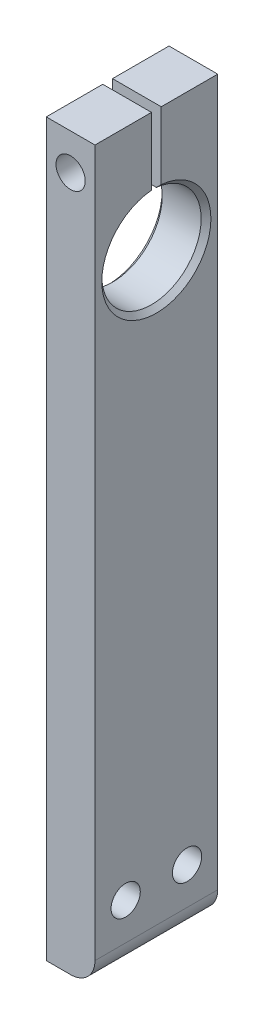
ISO-10303-21;
HEADER;
FILE_DESCRIPTION(('STEP AP214'),'2;1');
FILE_NAME('part.step','',(''),(''),'','','');
FILE_SCHEMA(('AUTOMOTIVE_DESIGN { 1 0 10303 214 1 1 1 1 }'));
ENDSEC;
DATA;
#1=APPLICATION_CONTEXT('core data for automotive mechanical design processes');
#2=APPLICATION_PROTOCOL_DEFINITION('international standard','automotive_design',2000,#1);
#3=PRODUCT_CONTEXT('',#1,'mechanical');
#4=PRODUCT('Part','Part','',(#3));
#5=PRODUCT_RELATED_PRODUCT_CATEGORY('part','',(#4));
#6=PRODUCT_DEFINITION_FORMATION('','',#4);
#7=PRODUCT_DEFINITION_CONTEXT('part definition',#1,'design');
#8=PRODUCT_DEFINITION('design','',#6,#7);
#9=PRODUCT_DEFINITION_SHAPE('','',#8);
#10=(LENGTH_UNIT() NAMED_UNIT(*) SI_UNIT(.MILLI.,.METRE.));
#11=(NAMED_UNIT(*) PLANE_ANGLE_UNIT() SI_UNIT($,.RADIAN.));
#12=(NAMED_UNIT(*) SI_UNIT($,.STERADIAN.) SOLID_ANGLE_UNIT());
#13=UNCERTAINTY_MEASURE_WITH_UNIT(LENGTH_MEASURE(1.E-05),#10,'distance_accuracy_value','');
#14=(GEOMETRIC_REPRESENTATION_CONTEXT(3) GLOBAL_UNCERTAINTY_ASSIGNED_CONTEXT((#13)) GLOBAL_UNIT_ASSIGNED_CONTEXT((#10,
#11,#12)) REPRESENTATION_CONTEXT('',''));
#15=CARTESIAN_POINT('',(0.,0.,0.));
#16=DIRECTION('',(0.,0.,1.));
#17=DIRECTION('',(1.,0.,0.));
#18=AXIS2_PLACEMENT_3D('',#15,#16,#17);
#19=CARTESIAN_POINT('',(10.,-112.4,6.3));
#20=DIRECTION('',(-1.,0.,0.));
#21=DIRECTION('',(0.,0.,1.));
#22=AXIS2_PLACEMENT_3D('',#19,#20,#21);
#23=CYLINDRICAL_SURFACE('',#22,1.70000000000001);
#24=CARTESIAN_POINT('',(0.,-112.4,6.3));
#25=DIRECTION('',(1.,0.,0.));
#26=DIRECTION('',(0.,0.,-1.));
#27=AXIS2_PLACEMENT_3D('',#24,#25,#26);
#28=CIRCLE('',#27,1.70000000000001);
#29=CARTESIAN_POINT('',(0.,-112.4,4.59999999999999));
#30=VERTEX_POINT('',#29);
#31=EDGE_CURVE('E233',#30,#30,#28,.T.);
#32=ORIENTED_EDGE('',*,*,#31,.F.);
#33=EDGE_LOOP('',(#32));
#34=FACE_BOUND('',#33,.T.);
#35=CARTESIAN_POINT('',(5.,-112.4,6.3));
#36=DIRECTION('',(1.,0.,0.));
#37=DIRECTION('',(0.,0.,-1.));
#38=AXIS2_PLACEMENT_3D('',#35,#36,#37);
#39=CIRCLE('',#38,1.70000000000001);
#40=CARTESIAN_POINT('',(5.,-112.4,4.59999999999999));
#41=VERTEX_POINT('',#40);
#42=EDGE_CURVE('E39',#41,#41,#39,.T.);
#43=ORIENTED_EDGE('',*,*,#42,.T.);
#44=EDGE_LOOP('',(#43));
#45=FACE_BOUND('',#44,.T.);
#46=ADVANCED_FACE('F34',(#34,#45),#23,.F.);
#47=CARTESIAN_POINT('',(10.,-112.4,-6.3));
#48=DIRECTION('',(-1.,0.,0.));
#49=DIRECTION('',(0.,0.,1.));
#50=AXIS2_PLACEMENT_3D('',#47,#48,#49);
#51=CYLINDRICAL_SURFACE('',#50,1.7);
#52=CARTESIAN_POINT('',(0.,-112.4,-6.3));
#53=DIRECTION('',(1.,0.,0.));
#54=DIRECTION('',(0.,0.,-1.));
#55=AXIS2_PLACEMENT_3D('',#52,#53,#54);
#56=CIRCLE('',#55,1.7);
#57=CARTESIAN_POINT('',(0.,-112.4,-8.));
#58=VERTEX_POINT('',#57);
#59=EDGE_CURVE('E228',#58,#58,#56,.T.);
#60=ORIENTED_EDGE('',*,*,#59,.F.);
#61=EDGE_LOOP('',(#60));
#62=FACE_BOUND('',#61,.T.);
#63=CARTESIAN_POINT('',(5.,-112.4,-6.3));
#64=DIRECTION('',(1.,0.,0.));
#65=DIRECTION('',(0.,0.,-1.));
#66=AXIS2_PLACEMENT_3D('',#63,#64,#65);
#67=CIRCLE('',#66,1.7);
#68=CARTESIAN_POINT('',(5.,-112.4,-8.));
#69=VERTEX_POINT('',#68);
#70=EDGE_CURVE('E394',#69,#69,#67,.T.);
#71=ORIENTED_EDGE('',*,*,#70,.T.);
#72=EDGE_LOOP('',(#71));
#73=FACE_BOUND('',#72,.T.);
#74=ADVANCED_FACE('F318',(#62,#73),#51,.F.);
#75=CARTESIAN_POINT('',(5.,17.575,-12.6));
#76=DIRECTION('',(0.,0.,1.));
#77=DIRECTION('',(1.,0.,0.));
#78=AXIS2_PLACEMENT_3D('',#75,#76,#77);
#79=CYLINDRICAL_SURFACE('',#78,1.7);
#80=CARTESIAN_POINT('',(5.,17.575,1.));
#81=DIRECTION('',(0.,0.,1.));
#82=DIRECTION('',(0.,-1.,0.));
#83=AXIS2_PLACEMENT_3D('',#80,#81,#82);
#84=CIRCLE('',#83,1.7);
#85=CARTESIAN_POINT('',(5.,15.875,1.));
#86=VERTEX_POINT('',#85);
#87=EDGE_CURVE('E211',#86,#86,#84,.T.);
#88=ORIENTED_EDGE('',*,*,#87,.F.);
#89=EDGE_LOOP('',(#88));
#90=FACE_BOUND('',#89,.T.);
#91=CARTESIAN_POINT('',(5.,17.575,4.6));
#92=DIRECTION('',(0.,0.,1.));
#93=DIRECTION('',(1.,0.,0.));
#94=AXIS2_PLACEMENT_3D('',#91,#92,#93);
#95=CIRCLE('',#94,1.7);
#96=CARTESIAN_POINT('',(6.7,17.575,4.6));
#97=VERTEX_POINT('',#96);
#98=EDGE_CURVE('E192',#97,#97,#95,.F.);
#99=ORIENTED_EDGE('',*,*,#98,.F.);
#100=EDGE_LOOP('',(#99));
#101=FACE_BOUND('',#100,.T.);
#102=ADVANCED_FACE('F362',(#90,#101),#79,.F.);
#103=CARTESIAN_POINT('',(0.,0.,0.));
#104=DIRECTION('',(-1.,0.,0.));
#105=DIRECTION('',(0.,0.,1.));
#106=AXIS2_PLACEMENT_3D('',#103,#104,#105);
#107=PLANE('',#106);
#108=ORIENTED_EDGE('',*,*,#59,.T.);
#109=EDGE_LOOP('',(#108));
#110=FACE_BOUND('',#109,.T.);
#111=ORIENTED_EDGE('',*,*,#31,.T.);
#112=EDGE_LOOP('',(#111));
#113=FACE_BOUND('',#112,.T.);
#114=DIRECTION('',(0.,1.,0.));
#115=VECTOR('',#114,1.);
#116=CARTESIAN_POINT('',(0.,25.,0.999999999999999));
#117=LINE('',#116,#115);
#118=CARTESIAN_POINT('',(0.,11.1552678139075,1.));
#119=VERTEX_POINT('',#118);
#120=CARTESIAN_POINT('',(0.,25.,0.999999999999999));
#121=VERTEX_POINT('',#120);
#122=EDGE_CURVE('E216',#119,#121,#117,.T.);
#123=ORIENTED_EDGE('',*,*,#122,.F.);
#124=CARTESIAN_POINT('',(0.,0.,0.));
#125=DIRECTION('',(-1.,0.,0.));
#126=DIRECTION('',(0.,0.,1.));
#127=AXIS2_PLACEMENT_3D('',#124,#125,#126);
#128=CIRCLE('',#127,11.2);
#129=CARTESIAN_POINT('',(0.,11.1552678139075,-1.));
#130=VERTEX_POINT('',#129);
#131=EDGE_CURVE('E11',#119,#130,#128,.F.);
#132=ORIENTED_EDGE('',*,*,#131,.T.);
#133=DIRECTION('',(0.,-1.,0.));
#134=VECTOR('',#133,1.);
#135=CARTESIAN_POINT('',(0.,25.,-1.));
#136=LINE('',#135,#134);
#137=CARTESIAN_POINT('',(0.,25.,-1.));
#138=VERTEX_POINT('',#137);
#139=EDGE_CURVE('E220',#138,#130,#136,.T.);
#140=ORIENTED_EDGE('',*,*,#139,.F.);
#141=DIRECTION('',(0.,0.,1.));
#142=VECTOR('',#141,1.);
#143=CARTESIAN_POINT('',(0.,25.,12.6));
#144=LINE('',#143,#142);
#145=CARTESIAN_POINT('',(0.,25.,-12.6));
#146=VERTEX_POINT('',#145);
#147=EDGE_CURVE('E250',#146,#138,#144,.T.);
#148=ORIENTED_EDGE('',*,*,#147,.F.);
#149=DIRECTION('',(0.,1.,0.));
#150=VECTOR('',#149,1.);
#151=CARTESIAN_POINT('',(0.,25.,-12.6));
#152=LINE('',#151,#150);
#153=CARTESIAN_POINT('',(0.,-125.,-12.6));
#154=VERTEX_POINT('',#153);
#155=EDGE_CURVE('E236',#154,#146,#152,.T.);
#156=ORIENTED_EDGE('',*,*,#155,.F.);
#157=DIRECTION('',(0.,0.,-1.));
#158=VECTOR('',#157,1.);
#159=CARTESIAN_POINT('',(0.,-125.,12.6));
#160=LINE('',#159,#158);
#161=CARTESIAN_POINT('',(0.,-125.,12.6));
#162=VERTEX_POINT('',#161);
#163=EDGE_CURVE('E240',#162,#154,#160,.T.);
#164=ORIENTED_EDGE('',*,*,#163,.F.);
#165=DIRECTION('',(0.,-1.,0.));
#166=VECTOR('',#165,1.);
#167=CARTESIAN_POINT('',(0.,-25.,12.6));
#168=LINE('',#167,#166);
#169=CARTESIAN_POINT('',(0.,25.,12.6));
#170=VERTEX_POINT('',#169);
#171=EDGE_CURVE('E253',#170,#162,#168,.T.);
#172=ORIENTED_EDGE('',*,*,#171,.F.);
#173=EDGE_CURVE('E249',#121,#170,#144,.T.);
#174=ORIENTED_EDGE('',*,*,#173,.F.);
#175=EDGE_LOOP('',(#123,#132,#140,#148,#156,#164,#172,#174));
#176=FACE_BOUND('',#175,.T.);
#177=DIRECTION('',(0.,0.,1.));
#178=VECTOR('',#177,1.);
#179=CARTESIAN_POINT('',(0.,14.575,-6.5));
#180=LINE('',#179,#178);
#181=CARTESIAN_POINT('',(0.,14.575,-6.5));
#182=VERTEX_POINT('',#181);
#183=CARTESIAN_POINT('',(0.,14.575,-4.));
#184=VERTEX_POINT('',#183);
#185=EDGE_CURVE('E202',#182,#184,#180,.T.);
#186=ORIENTED_EDGE('',*,*,#185,.F.);
#187=DIRECTION('',(0.,-1.,0.));
#188=VECTOR('',#187,1.);
#189=CARTESIAN_POINT('',(0.,20.575,-6.5));
#190=LINE('',#189,#188);
#191=CARTESIAN_POINT('',(0.,20.575,-6.5));
#192=VERTEX_POINT('',#191);
#193=EDGE_CURVE('E187',#192,#182,#190,.T.);
#194=ORIENTED_EDGE('',*,*,#193,.F.);
#195=DIRECTION('',(0.,0.,1.));
#196=VECTOR('',#195,1.);
#197=CARTESIAN_POINT('',(0.,20.575,-6.5));
#198=LINE('',#197,#196);
#199=CARTESIAN_POINT('',(0.,20.575,-4.));
#200=VERTEX_POINT('',#199);
#201=EDGE_CURVE('E204',#192,#200,#198,.T.);
#202=ORIENTED_EDGE('',*,*,#201,.T.);
#203=DIRECTION('',(0.,-1.,0.));
#204=VECTOR('',#203,1.);
#205=CARTESIAN_POINT('',(0.,20.575,-4.));
#206=LINE('',#205,#204);
#207=EDGE_CURVE('E180',#200,#184,#206,.T.);
#208=ORIENTED_EDGE('',*,*,#207,.T.);
#209=EDGE_LOOP('',(#186,#194,#202,#208));
#210=FACE_BOUND('',#209,.T.);
#211=ADVANCED_FACE('F358',(#110,#113,#176,#210),#107,.T.);
#212=CARTESIAN_POINT('',(5.,17.575,-12.6));
#213=DIRECTION('',(0.,0.,1.));
#214=DIRECTION('',(1.,0.,0.));
#215=AXIS2_PLACEMENT_3D('',#212,#213,#214);
#216=CIRCLE('',#215,1.7);
#217=CARTESIAN_POINT('',(6.7,17.575,-12.6));
#218=VERTEX_POINT('',#217);
#219=EDGE_CURVE('E208',#218,#218,#216,.T.);
#220=ORIENTED_EDGE('',*,*,#219,.F.);
#221=EDGE_LOOP('',(#220));
#222=FACE_BOUND('',#221,.T.);
#223=CARTESIAN_POINT('',(5.,17.575,-6.5));
#224=DIRECTION('',(0.,0.,1.));
#225=DIRECTION('',(1.,0.,0.));
#226=AXIS2_PLACEMENT_3D('',#223,#224,#225);
#227=CIRCLE('',#226,1.7);
#228=CARTESIAN_POINT('',(6.7,17.575,-6.5));
#229=VERTEX_POINT('',#228);
#230=EDGE_CURVE('E212',#229,#229,#227,.F.);
#231=ORIENTED_EDGE('',*,*,#230,.F.);
#232=EDGE_LOOP('',(#231));
#233=FACE_BOUND('',#232,.T.);
#234=ADVANCED_FACE('F361',(#222,#233),#79,.F.);
#235=CARTESIAN_POINT('',(10.,25.,12.6));
#236=DIRECTION('',(0.,-1.,0.));
#237=DIRECTION('',(0.,0.,-1.));
#238=AXIS2_PLACEMENT_3D('',#235,#236,#237);
#239=PLANE('',#238);
#240=DIRECTION('',(0.,0.,1.));
#241=VECTOR('',#240,1.);
#242=CARTESIAN_POINT('',(10.,25.,12.6));
#243=LINE('',#242,#241);
#244=CARTESIAN_POINT('',(10.,25.,0.999999999999999));
#245=VERTEX_POINT('',#244);
#246=CARTESIAN_POINT('',(10.,25.,12.6));
#247=VERTEX_POINT('',#246);
#248=EDGE_CURVE('E239',#245,#247,#243,.T.);
#249=ORIENTED_EDGE('',*,*,#248,.F.);
#250=DIRECTION('',(-1.,0.,0.));
#251=VECTOR('',#250,1.);
#252=CARTESIAN_POINT('',(10.,25.,0.999999999999999));
#253=LINE('',#252,#251);
#254=EDGE_CURVE('E222',#245,#121,#253,.T.);
#255=ORIENTED_EDGE('',*,*,#254,.T.);
#256=ORIENTED_EDGE('',*,*,#173,.T.);
#257=DIRECTION('',(-1.,0.,0.));
#258=VECTOR('',#257,1.);
#259=CARTESIAN_POINT('',(10.,25.,12.6));
#260=LINE('',#259,#258);
#261=EDGE_CURVE('E261',#247,#170,#260,.T.);
#262=ORIENTED_EDGE('',*,*,#261,.F.);
#263=EDGE_LOOP('',(#249,#255,#256,#262));
#264=FACE_BOUND('',#263,.T.);
#265=ADVANCED_FACE('F350',(#264),#239,.F.);
#266=CARTESIAN_POINT('',(10.,0.,0.));
#267=DIRECTION('',(-1.,0.,0.));
#268=DIRECTION('',(0.,0.,1.));
#269=AXIS2_PLACEMENT_3D('',#266,#267,#268);
#270=PLANE('',#269);
#271=CARTESIAN_POINT('',(10.,-112.4,6.3));
#272=DIRECTION('',(1.,0.,0.));
#273=DIRECTION('',(0.,0.,-1.));
#274=AXIS2_PLACEMENT_3D('',#271,#272,#273);
#275=CIRCLE('',#274,3.);
#276=CARTESIAN_POINT('',(10.,-112.4,3.3));
#277=VERTEX_POINT('',#276);
#278=EDGE_CURVE('E386',#277,#277,#275,.T.);
#279=ORIENTED_EDGE('',*,*,#278,.F.);
#280=EDGE_LOOP('',(#279));
#281=FACE_BOUND('',#280,.T.);
#282=CARTESIAN_POINT('',(10.,-112.4,-6.3));
#283=DIRECTION('',(1.,0.,0.));
#284=DIRECTION('',(0.,0.,-1.));
#285=AXIS2_PLACEMENT_3D('',#282,#283,#284);
#286=CIRCLE('',#285,3.);
#287=CARTESIAN_POINT('',(10.,-112.4,-9.3));
#288=VERTEX_POINT('',#287);
#289=EDGE_CURVE('E380',#288,#288,#286,.T.);
#290=ORIENTED_EDGE('',*,*,#289,.F.);
#291=EDGE_LOOP('',(#290));
#292=FACE_BOUND('',#291,.T.);
#293=DIRECTION('',(0.,-1.,0.));
#294=VECTOR('',#293,1.);
#295=CARTESIAN_POINT('',(10.,25.,-1.));
#296=LINE('',#295,#294);
#297=CARTESIAN_POINT('',(10.,25.,-1.));
#298=VERTEX_POINT('',#297);
#299=CARTESIAN_POINT('',(10.,11.1552678139075,-1.));
#300=VERTEX_POINT('',#299);
#301=EDGE_CURVE('E219',#298,#300,#296,.T.);
#302=ORIENTED_EDGE('',*,*,#301,.T.);
#303=CARTESIAN_POINT('',(10.,0.,0.));
#304=DIRECTION('',(-1.,0.,0.));
#305=DIRECTION('',(0.,0.,1.));
#306=AXIS2_PLACEMENT_3D('',#303,#304,#305);
#307=CIRCLE('',#306,11.2);
#308=CARTESIAN_POINT('',(10.,11.1552678139075,1.));
#309=VERTEX_POINT('',#308);
#310=EDGE_CURVE('E60',#300,#309,#307,.T.);
#311=ORIENTED_EDGE('',*,*,#310,.T.);
#312=DIRECTION('',(0.,1.,0.));
#313=VECTOR('',#312,1.);
#314=CARTESIAN_POINT('',(10.,25.,0.999999999999999));
#315=LINE('',#314,#313);
#316=EDGE_CURVE('E217',#309,#245,#315,.T.);
#317=ORIENTED_EDGE('',*,*,#316,.T.);
#318=ORIENTED_EDGE('',*,*,#248,.T.);
#319=DIRECTION('',(0.,-1.,0.));
#320=VECTOR('',#319,1.);
#321=CARTESIAN_POINT('',(10.,25.,12.6));
#322=LINE('',#321,#320);
#323=CARTESIAN_POINT('',(10.,-120.,12.6));
#324=VERTEX_POINT('',#323);
#325=EDGE_CURVE('E244',#247,#324,#322,.T.);
#326=ORIENTED_EDGE('',*,*,#325,.T.);
#327=DIRECTION('',(0.,0.,-1.));
#328=VECTOR('',#327,1.);
#329=CARTESIAN_POINT('',(10.,-120.,0.));
#330=LINE('',#329,#328);
#331=CARTESIAN_POINT('',(10.,-120.,-12.6));
#332=VERTEX_POINT('',#331);
#333=EDGE_CURVE('E272',#324,#332,#330,.T.);
#334=ORIENTED_EDGE('',*,*,#333,.T.);
#335=DIRECTION('',(0.,1.,0.));
#336=VECTOR('',#335,1.);
#337=CARTESIAN_POINT('',(10.,-125.,-12.6));
#338=LINE('',#337,#336);
#339=CARTESIAN_POINT('',(10.,25.,-12.6));
#340=VERTEX_POINT('',#339);
#341=EDGE_CURVE('E237',#332,#340,#338,.T.);
#342=ORIENTED_EDGE('',*,*,#341,.T.);
#343=EDGE_CURVE('E241',#340,#298,#243,.T.);
#344=ORIENTED_EDGE('',*,*,#343,.T.);
#345=EDGE_LOOP('',(#302,#311,#317,#318,#326,#334,#342,#344));
#346=FACE_BOUND('',#345,.T.);
#347=ADVANCED_FACE('F344',(#281,#292,#346),#270,.F.);
#348=CARTESIAN_POINT('',(10.,25.,-12.6));
#349=DIRECTION('',(0.,0.,1.));
#350=DIRECTION('',(0.,-1.,0.));
#351=AXIS2_PLACEMENT_3D('',#348,#349,#350);
#352=PLANE('',#351);
#353=ORIENTED_EDGE('',*,*,#219,.T.);
#354=EDGE_LOOP('',(#353));
#355=FACE_BOUND('',#354,.T.);
#356=ORIENTED_EDGE('',*,*,#341,.F.);
#357=CARTESIAN_POINT('',(5.,-120.,-12.6));
#358=DIRECTION('',(0.,0.,1.));
#359=DIRECTION('',(0.,-1.,0.));
#360=AXIS2_PLACEMENT_3D('',#357,#358,#359);
#361=CIRCLE('',#360,5.);
#362=CARTESIAN_POINT('',(5.,-125.,-12.6));
#363=VERTEX_POINT('',#362);
#364=EDGE_CURVE('E281',#332,#363,#361,.F.);
#365=ORIENTED_EDGE('',*,*,#364,.T.);
#366=DIRECTION('',(-1.,0.,0.));
#367=VECTOR('',#366,1.);
#368=CARTESIAN_POINT('',(10.,-125.,-12.6));
#369=LINE('',#368,#367);
#370=EDGE_CURVE('E247',#363,#154,#369,.T.);
#371=ORIENTED_EDGE('',*,*,#370,.T.);
#372=ORIENTED_EDGE('',*,*,#155,.T.);
#373=DIRECTION('',(-1.,0.,0.));
#374=VECTOR('',#373,1.);
#375=CARTESIAN_POINT('',(10.,25.,-12.6));
#376=LINE('',#375,#374);
#377=EDGE_CURVE('E264',#340,#146,#376,.T.);
#378=ORIENTED_EDGE('',*,*,#377,.F.);
#379=EDGE_LOOP('',(#356,#365,#371,#372,#378));
#380=FACE_BOUND('',#379,.T.);
#381=ADVANCED_FACE('F340',(#355,#380),#352,.F.);
#382=ORIENTED_EDGE('',*,*,#147,.T.);
#383=DIRECTION('',(-1.,0.,0.));
#384=VECTOR('',#383,1.);
#385=CARTESIAN_POINT('',(10.,25.,-1.));
#386=LINE('',#385,#384);
#387=EDGE_CURVE('E226',#298,#138,#386,.T.);
#388=ORIENTED_EDGE('',*,*,#387,.F.);
#389=ORIENTED_EDGE('',*,*,#343,.F.);
#390=ORIENTED_EDGE('',*,*,#377,.T.);
#391=EDGE_LOOP('',(#382,#388,#389,#390));
#392=FACE_BOUND('',#391,.T.);
#393=ADVANCED_FACE('F343',(#392),#239,.F.);
#394=CARTESIAN_POINT('',(10.,-25.,12.6));
#395=DIRECTION('',(0.,0.,-1.));
#396=DIRECTION('',(-1.,0.,0.));
#397=AXIS2_PLACEMENT_3D('',#394,#395,#396);
#398=PLANE('',#397);
#399=CARTESIAN_POINT('',(5.,17.575,12.6));
#400=DIRECTION('',(0.,0.,1.));
#401=DIRECTION('',(1.,0.,0.));
#402=AXIS2_PLACEMENT_3D('',#399,#400,#401);
#403=CIRCLE('',#402,3.);
#404=CARTESIAN_POINT('',(8.,17.575,12.6));
#405=VERTEX_POINT('',#404);
#406=EDGE_CURVE('E183',#405,#405,#403,.T.);
#407=ORIENTED_EDGE('',*,*,#406,.F.);
#408=EDGE_LOOP('',(#407));
#409=FACE_BOUND('',#408,.T.);
#410=DIRECTION('',(-1.,0.,0.));
#411=VECTOR('',#410,1.);
#412=CARTESIAN_POINT('',(10.,-125.,12.6));
#413=LINE('',#412,#411);
#414=CARTESIAN_POINT('',(5.,-125.,12.6));
#415=VERTEX_POINT('',#414);
#416=EDGE_CURVE('E259',#415,#162,#413,.T.);
#417=ORIENTED_EDGE('',*,*,#416,.F.);
#418=CARTESIAN_POINT('',(5.,-120.,12.6));
#419=DIRECTION('',(0.,0.,-1.));
#420=DIRECTION('',(-1.,0.,0.));
#421=AXIS2_PLACEMENT_3D('',#418,#419,#420);
#422=CIRCLE('',#421,5.);
#423=EDGE_CURVE('E285',#415,#324,#422,.F.);
#424=ORIENTED_EDGE('',*,*,#423,.T.);
#425=ORIENTED_EDGE('',*,*,#325,.F.);
#426=ORIENTED_EDGE('',*,*,#261,.T.);
#427=ORIENTED_EDGE('',*,*,#171,.T.);
#428=EDGE_LOOP('',(#417,#424,#425,#426,#427));
#429=FACE_BOUND('',#428,.T.);
#430=ADVANCED_FACE('F348',(#409,#429),#398,.F.);
#431=CARTESIAN_POINT('',(10.,-125.,12.6));
#432=DIRECTION('',(0.,1.,0.));
#433=DIRECTION('',(0.,0.,1.));
#434=AXIS2_PLACEMENT_3D('',#431,#432,#433);
#435=PLANE('',#434);
#436=ORIENTED_EDGE('',*,*,#370,.F.);
#437=DIRECTION('',(0.,0.,-1.));
#438=VECTOR('',#437,1.);
#439=CARTESIAN_POINT('',(5.,-125.,12.6));
#440=LINE('',#439,#438);
#441=EDGE_CURVE('E283',#363,#415,#440,.F.);
#442=ORIENTED_EDGE('',*,*,#441,.T.);
#443=ORIENTED_EDGE('',*,*,#416,.T.);
#444=ORIENTED_EDGE('',*,*,#163,.T.);
#445=EDGE_LOOP('',(#436,#442,#443,#444));
#446=FACE_BOUND('',#445,.T.);
#447=ADVANCED_FACE('F353',(#446),#435,.F.);
#448=CARTESIAN_POINT('',(10.,0.,0.));
#449=DIRECTION('',(-1.,0.,0.));
#450=DIRECTION('',(0.,0.,1.));
#451=AXIS2_PLACEMENT_3D('',#448,#449,#450);
#452=CYLINDRICAL_SURFACE('',#451,10.2);
#453=DIRECTION('',(-1.,0.,0.));
#454=VECTOR('',#453,1.);
#455=CARTESIAN_POINT('',(10.,10.1508620323596,1.));
#456=LINE('',#455,#454);
#457=CARTESIAN_POINT('',(9.00000000000001,10.1508620323596,1.));
#458=VERTEX_POINT('',#457);
#459=CARTESIAN_POINT('',(0.99999999999998,10.1508620323596,1.));
#460=VERTEX_POINT('',#459);
#461=EDGE_CURVE('E270',#458,#460,#456,.T.);
#462=ORIENTED_EDGE('',*,*,#461,.F.);
#463=CARTESIAN_POINT('',(9.00000000000001,0.,0.));
#464=DIRECTION('',(-1.,0.,0.));
#465=DIRECTION('',(0.,0.,1.));
#466=AXIS2_PLACEMENT_3D('',#463,#464,#465);
#467=CIRCLE('',#466,10.2);
#468=CARTESIAN_POINT('',(9.00000000000001,10.1508620323596,-1.));
#469=VERTEX_POINT('',#468);
#470=EDGE_CURVE('E289',#458,#469,#467,.F.);
#471=ORIENTED_EDGE('',*,*,#470,.T.);
#472=DIRECTION('',(-1.,0.,0.));
#473=VECTOR('',#472,1.);
#474=CARTESIAN_POINT('',(10.,10.1508620323596,-1.));
#475=LINE('',#474,#473);
#476=CARTESIAN_POINT('',(0.99999999999998,10.1508620323596,-1.));
#477=VERTEX_POINT('',#476);
#478=EDGE_CURVE('E267',#477,#469,#475,.F.);
#479=ORIENTED_EDGE('',*,*,#478,.F.);
#480=CARTESIAN_POINT('',(0.99999999999998,0.,0.));
#481=DIRECTION('',(-1.,0.,0.));
#482=DIRECTION('',(0.,0.,1.));
#483=AXIS2_PLACEMENT_3D('',#480,#481,#482);
#484=CIRCLE('',#483,10.2);
#485=EDGE_CURVE('E287',#477,#460,#484,.T.);
#486=ORIENTED_EDGE('',*,*,#485,.T.);
#487=EDGE_LOOP('',(#462,#471,#479,#486));
#488=FACE_BOUND('',#487,.T.);
#489=ADVANCED_FACE('F309',(#488),#452,.F.);
#490=CARTESIAN_POINT('',(10.,25.,-1.));
#491=DIRECTION('',(0.,0.,-1.));
#492=DIRECTION('',(0.,1.,0.));
#493=AXIS2_PLACEMENT_3D('',#490,#491,#492);
#494=PLANE('',#493);
#495=CARTESIAN_POINT('',(5.,17.575,-0.999999999999999));
#496=DIRECTION('',(0.,0.,-1.));
#497=DIRECTION('',(0.,1.,0.));
#498=AXIS2_PLACEMENT_3D('',#495,#496,#497);
#499=CIRCLE('',#498,1.7);
#500=CARTESIAN_POINT('',(5.,19.275,-0.999999999999999));
#501=VERTEX_POINT('',#500);
#502=EDGE_CURVE('E213',#501,#501,#499,.T.);
#503=ORIENTED_EDGE('',*,*,#502,.T.);
#504=EDGE_LOOP('',(#503));
#505=FACE_BOUND('',#504,.T.);
#506=ORIENTED_EDGE('',*,*,#478,.T.);
#507=CARTESIAN_POINT('',(9.00000000000001,10.1508620323596,-1.));
#508=CARTESIAN_POINT('',(9.16663212704616,10.3182973842307,-1.));
#509=CARTESIAN_POINT('',(9.33328152394402,10.4857155420035,-1.));
#510=CARTESIAN_POINT('',(9.66661485727739,10.8205174691861,-1.));
#511=CARTESIAN_POINT('',(9.83329879371286,10.9879012385959,-1.));
#512=CARTESIAN_POINT('',(10.,11.1552678139075,-1.));
#513=B_SPLINE_CURVE_WITH_KNOTS('',3,(#507,#508,#509,#510,#511,#512),.UNSPECIFIED.,.F.,.F.,(4,2,
4),(0.,0.708666176239692,1.41733235177449),.UNSPECIFIED.);
#514=EDGE_CURVE('E298',#469,#300,#513,.T.);
#515=ORIENTED_EDGE('',*,*,#514,.T.);
#516=ORIENTED_EDGE('',*,*,#301,.F.);
#517=ORIENTED_EDGE('',*,*,#387,.T.);
#518=ORIENTED_EDGE('',*,*,#139,.T.);
#519=CARTESIAN_POINT('',(0.,11.1552678139075,-1.));
#520=CARTESIAN_POINT('',(0.16670120628714,10.9879012385959,-1.));
#521=CARTESIAN_POINT('',(0.333385142722605,10.8205174691861,-1.));
#522=CARTESIAN_POINT('',(0.666718476055966,10.4857155420035,-1.));
#523=CARTESIAN_POINT('',(0.833367872953828,10.3182973842307,-1.));
#524=CARTESIAN_POINT('',(0.99999999999998,10.1508620323596,-1.));
#525=B_SPLINE_CURVE_WITH_KNOTS('',3,(#519,#520,#521,#522,#523,#524),.UNSPECIFIED.,.F.,.F.,(4,2,
4),(0.,0.708666175534788,1.41733235177447),.UNSPECIFIED.);
#526=EDGE_CURVE('E292',#130,#477,#525,.T.);
#527=ORIENTED_EDGE('',*,*,#526,.T.);
#528=EDGE_LOOP('',(#506,#515,#516,#517,#518,#527));
#529=FACE_BOUND('',#528,.T.);
#530=ADVANCED_FACE('F303',(#505,#529),#494,.F.);
#531=CARTESIAN_POINT('',(10.,25.,0.999999999999999));
#532=DIRECTION('',(0.,0.,1.));
#533=DIRECTION('',(0.,-1.,0.));
#534=AXIS2_PLACEMENT_3D('',#531,#532,#533);
#535=PLANE('',#534);
#536=ORIENTED_EDGE('',*,*,#87,.T.);
#537=EDGE_LOOP('',(#536));
#538=FACE_BOUND('',#537,.T.);
#539=ORIENTED_EDGE('',*,*,#316,.F.);
#540=CARTESIAN_POINT('',(10.,11.1552678139075,1.));
#541=CARTESIAN_POINT('',(9.83329879371286,10.9879012385959,1.));
#542=CARTESIAN_POINT('',(9.66661485727739,10.8205174691861,1.));
#543=CARTESIAN_POINT('',(9.33328152394402,10.4857155420035,1.));
#544=CARTESIAN_POINT('',(9.16663212704616,10.3182973842307,1.));
#545=CARTESIAN_POINT('',(9.00000000000001,10.1508620323596,1.));
#546=B_SPLINE_CURVE_WITH_KNOTS('',3,(#540,#541,#542,#543,#544,#545),.UNSPECIFIED.,.F.,.F.,(4,2,
4),(0.,0.708666175534799,1.41733235177449),.UNSPECIFIED.);
#547=EDGE_CURVE('E44',#309,#458,#546,.T.);
#548=ORIENTED_EDGE('',*,*,#547,.T.);
#549=ORIENTED_EDGE('',*,*,#461,.T.);
#550=CARTESIAN_POINT('',(0.99999999999998,10.1508620323596,1.));
#551=CARTESIAN_POINT('',(0.833367872953827,10.3182973842307,1.));
#552=CARTESIAN_POINT('',(0.666718476055966,10.4857155420035,1.));
#553=CARTESIAN_POINT('',(0.333385142722605,10.8205174691861,1.));
#554=CARTESIAN_POINT('',(0.16670120628714,10.9879012385959,1.));
#555=CARTESIAN_POINT('',(0.,11.1552678139075,1.));
#556=B_SPLINE_CURVE_WITH_KNOTS('',3,(#550,#551,#552,#553,#554,#555),.UNSPECIFIED.,.F.,.F.,(4,2,
4),(0.,0.708666176239683,1.41733235177447),.UNSPECIFIED.);
#557=EDGE_CURVE('E52',#460,#119,#556,.T.);
#558=ORIENTED_EDGE('',*,*,#557,.T.);
#559=ORIENTED_EDGE('',*,*,#122,.T.);
#560=ORIENTED_EDGE('',*,*,#254,.F.);
#561=EDGE_LOOP('',(#539,#548,#549,#558,#559,#560));
#562=FACE_BOUND('',#561,.T.);
#563=ADVANCED_FACE('F308',(#538,#562),#535,.F.);
#564=CARTESIAN_POINT('',(5.,17.575,-4.));
#565=DIRECTION('',(0.,0.,1.));
#566=DIRECTION('',(1.,0.,0.));
#567=AXIS2_PLACEMENT_3D('',#564,#565,#566);
#568=CIRCLE('',#567,1.7);
#569=CARTESIAN_POINT('',(6.7,17.575,-4.));
#570=VERTEX_POINT('',#569);
#571=EDGE_CURVE('E201',#570,#570,#568,.F.);
#572=ORIENTED_EDGE('',*,*,#571,.T.);
#573=EDGE_LOOP('',(#572));
#574=FACE_BOUND('',#573,.T.);
#575=ORIENTED_EDGE('',*,*,#502,.F.);
#576=EDGE_LOOP('',(#575));
#577=FACE_BOUND('',#576,.T.);
#578=ADVANCED_FACE('F311',(#574,#577),#79,.F.);
#579=CARTESIAN_POINT('',(0.,0.,-6.5));
#580=DIRECTION('',(0.,0.,1.));
#581=DIRECTION('',(1.,0.,0.));
#582=AXIS2_PLACEMENT_3D('',#579,#580,#581);
#583=PLANE('',#582);
#584=DIRECTION('',(0.5,0.866025403784439,0.));
#585=VECTOR('',#584,1.);
#586=CARTESIAN_POINT('',(6.73205080756888,14.575,-6.5));
#587=LINE('',#586,#585);
#588=CARTESIAN_POINT('',(6.73205080756888,14.575,-6.5));
#589=VERTEX_POINT('',#588);
#590=CARTESIAN_POINT('',(8.46410161513776,17.575,-6.5));
#591=VERTEX_POINT('',#590);
#592=EDGE_CURVE('E156',#589,#591,#587,.T.);
#593=ORIENTED_EDGE('',*,*,#592,.T.);
#594=DIRECTION('',(-0.5,0.866025403784439,0.));
#595=VECTOR('',#594,1.);
#596=CARTESIAN_POINT('',(8.46410161513776,17.575,-6.5));
#597=LINE('',#596,#595);
#598=CARTESIAN_POINT('',(6.73205080756888,20.575,-6.5));
#599=VERTEX_POINT('',#598);
#600=EDGE_CURVE('E166',#591,#599,#597,.T.);
#601=ORIENTED_EDGE('',*,*,#600,.T.);
#602=DIRECTION('',(-1.,0.,0.));
#603=VECTOR('',#602,1.);
#604=CARTESIAN_POINT('',(6.73205080756888,20.575,-6.5));
#605=LINE('',#604,#603);
#606=EDGE_CURVE('E171',#599,#192,#605,.T.);
#607=ORIENTED_EDGE('',*,*,#606,.T.);
#608=ORIENTED_EDGE('',*,*,#193,.T.);
#609=DIRECTION('',(1.,0.,0.));
#610=VECTOR('',#609,1.);
#611=CARTESIAN_POINT('',(0.,14.575,-6.5));
#612=LINE('',#611,#610);
#613=EDGE_CURVE('E163',#182,#589,#612,.T.);
#614=ORIENTED_EDGE('',*,*,#613,.T.);
#615=EDGE_LOOP('',(#593,#601,#607,#608,#614));
#616=FACE_BOUND('',#615,.T.);
#617=ORIENTED_EDGE('',*,*,#230,.T.);
#618=EDGE_LOOP('',(#617));
#619=FACE_BOUND('',#618,.T.);
#620=ADVANCED_FACE('F173',(#616,#619),#583,.T.);
#621=CARTESIAN_POINT('',(0.,0.,-4.));
#622=DIRECTION('',(0.,0.,1.));
#623=DIRECTION('',(1.,0.,0.));
#624=AXIS2_PLACEMENT_3D('',#621,#622,#623);
#625=PLANE('',#624);
#626=DIRECTION('',(0.5,0.866025403784439,0.));
#627=VECTOR('',#626,1.);
#628=CARTESIAN_POINT('',(6.73205080756888,14.575,-4.));
#629=LINE('',#628,#627);
#630=CARTESIAN_POINT('',(6.73205080756888,14.575,-4.));
#631=VERTEX_POINT('',#630);
#632=CARTESIAN_POINT('',(8.46410161513776,17.575,-4.));
#633=VERTEX_POINT('',#632);
#634=EDGE_CURVE('E158',#631,#633,#629,.T.);
#635=ORIENTED_EDGE('',*,*,#634,.F.);
#636=DIRECTION('',(1.,0.,0.));
#637=VECTOR('',#636,1.);
#638=CARTESIAN_POINT('',(3.26794919243112,14.575,-4.));
#639=LINE('',#638,#637);
#640=EDGE_CURVE('E177',#184,#631,#639,.T.);
#641=ORIENTED_EDGE('',*,*,#640,.F.);
#642=ORIENTED_EDGE('',*,*,#207,.F.);
#643=DIRECTION('',(-1.,0.,0.));
#644=VECTOR('',#643,1.);
#645=CARTESIAN_POINT('',(3.26794919243112,20.575,-4.));
#646=LINE('',#645,#644);
#647=CARTESIAN_POINT('',(6.73205080756888,20.575,-4.));
#648=VERTEX_POINT('',#647);
#649=EDGE_CURVE('E194',#648,#200,#646,.T.);
#650=ORIENTED_EDGE('',*,*,#649,.F.);
#651=DIRECTION('',(-0.5,0.866025403784439,0.));
#652=VECTOR('',#651,1.);
#653=CARTESIAN_POINT('',(8.46410161513776,17.575,-4.));
#654=LINE('',#653,#652);
#655=EDGE_CURVE('E191',#633,#648,#654,.T.);
#656=ORIENTED_EDGE('',*,*,#655,.F.);
#657=EDGE_LOOP('',(#635,#641,#642,#650,#656));
#658=FACE_BOUND('',#657,.T.);
#659=ORIENTED_EDGE('',*,*,#571,.F.);
#660=EDGE_LOOP('',(#659));
#661=FACE_BOUND('',#660,.T.);
#662=ADVANCED_FACE('F484',(#658,#661),#625,.F.);
#663=CARTESIAN_POINT('',(6.73205080756888,14.575,-6.5));
#664=DIRECTION('',(0.866025403784439,-0.5,0.));
#665=DIRECTION('',(0.5,0.866025403784439,0.));
#666=AXIS2_PLACEMENT_3D('',#663,#664,#665);
#667=PLANE('',#666);
#668=ORIENTED_EDGE('',*,*,#634,.T.);
#669=DIRECTION('',(0.,0.,1.));
#670=VECTOR('',#669,1.);
#671=CARTESIAN_POINT('',(8.46410161513776,17.575,-6.5));
#672=LINE('',#671,#670);
#673=EDGE_CURVE('E152',#591,#633,#672,.T.);
#674=ORIENTED_EDGE('',*,*,#673,.F.);
#675=ORIENTED_EDGE('',*,*,#592,.F.);
#676=DIRECTION('',(0.,0.,1.));
#677=VECTOR('',#676,1.);
#678=CARTESIAN_POINT('',(6.73205080756888,14.575,-6.5));
#679=LINE('',#678,#677);
#680=EDGE_CURVE('E199',#589,#631,#679,.T.);
#681=ORIENTED_EDGE('',*,*,#680,.T.);
#682=EDGE_LOOP('',(#668,#674,#675,#681));
#683=FACE_BOUND('',#682,.T.);
#684=ADVANCED_FACE('F154',(#683),#667,.F.);
#685=CARTESIAN_POINT('',(3.26794919243112,14.575,-6.5));
#686=DIRECTION('',(0.,-1.,0.));
#687=DIRECTION('',(0.,0.,-1.));
#688=AXIS2_PLACEMENT_3D('',#685,#686,#687);
#689=PLANE('',#688);
#690=ORIENTED_EDGE('',*,*,#640,.T.);
#691=ORIENTED_EDGE('',*,*,#680,.F.);
#692=ORIENTED_EDGE('',*,*,#613,.F.);
#693=ORIENTED_EDGE('',*,*,#185,.T.);
#694=EDGE_LOOP('',(#690,#691,#692,#693));
#695=FACE_BOUND('',#694,.T.);
#696=ADVANCED_FACE('F488',(#695),#689,.F.);
#697=CARTESIAN_POINT('',(3.26794919243112,20.575,-6.5));
#698=DIRECTION('',(0.,1.,0.));
#699=DIRECTION('',(0.,0.,1.));
#700=AXIS2_PLACEMENT_3D('',#697,#698,#699);
#701=PLANE('',#700);
#702=ORIENTED_EDGE('',*,*,#649,.T.);
#703=ORIENTED_EDGE('',*,*,#201,.F.);
#704=ORIENTED_EDGE('',*,*,#606,.F.);
#705=DIRECTION('',(0.,0.,1.));
#706=VECTOR('',#705,1.);
#707=CARTESIAN_POINT('',(6.73205080756888,20.575,-6.5));
#708=LINE('',#707,#706);
#709=EDGE_CURVE('E162',#599,#648,#708,.T.);
#710=ORIENTED_EDGE('',*,*,#709,.T.);
#711=EDGE_LOOP('',(#702,#703,#704,#710));
#712=FACE_BOUND('',#711,.T.);
#713=ADVANCED_FACE('F491',(#712),#701,.F.);
#714=CARTESIAN_POINT('',(8.46410161513776,17.575,-6.5));
#715=DIRECTION('',(0.866025403784439,0.5,0.));
#716=DIRECTION('',(-0.5,0.866025403784439,0.));
#717=AXIS2_PLACEMENT_3D('',#714,#715,#716);
#718=PLANE('',#717);
#719=ORIENTED_EDGE('',*,*,#655,.T.);
#720=ORIENTED_EDGE('',*,*,#709,.F.);
#721=ORIENTED_EDGE('',*,*,#600,.F.);
#722=ORIENTED_EDGE('',*,*,#673,.T.);
#723=EDGE_LOOP('',(#719,#720,#721,#722));
#724=FACE_BOUND('',#723,.T.);
#725=ADVANCED_FACE('F167',(#724),#718,.F.);
#726=CARTESIAN_POINT('',(5.,-120.,0.));
#727=DIRECTION('',(0.,0.,-1.));
#728=DIRECTION('',(-1.,0.,0.));
#729=AXIS2_PLACEMENT_3D('',#726,#727,#728);
#730=CYLINDRICAL_SURFACE('',#729,5.);
#731=ORIENTED_EDGE('',*,*,#423,.F.);
#732=ORIENTED_EDGE('',*,*,#441,.F.);
#733=ORIENTED_EDGE('',*,*,#364,.F.);
#734=ORIENTED_EDGE('',*,*,#333,.F.);
#735=EDGE_LOOP('',(#731,#732,#733,#734));
#736=FACE_BOUND('',#735,.T.);
#737=ADVANCED_FACE('F334',(#736),#730,.T.);
#738=CARTESIAN_POINT('',(9.00000000000001,0.,0.));
#739=DIRECTION('',(1.,0.,0.));
#740=DIRECTION('',(0.,0.,-1.));
#741=AXIS2_PLACEMENT_3D('',#738,#739,#740);
#742=CONICAL_SURFACE('',#741,10.2,0.785398163397452);
#743=ORIENTED_EDGE('',*,*,#547,.F.);
#744=ORIENTED_EDGE('',*,*,#310,.F.);
#745=ORIENTED_EDGE('',*,*,#514,.F.);
#746=ORIENTED_EDGE('',*,*,#470,.F.);
#747=EDGE_LOOP('',(#743,#744,#745,#746));
#748=FACE_BOUND('',#747,.T.);
#749=ADVANCED_FACE('F330',(#748),#742,.F.);
#750=CARTESIAN_POINT('',(0.,0.,0.));
#751=DIRECTION('',(-1.,0.,0.));
#752=DIRECTION('',(0.,0.,1.));
#753=AXIS2_PLACEMENT_3D('',#750,#751,#752);
#754=CONICAL_SURFACE('',#753,11.2,0.785398163397453);
#755=ORIENTED_EDGE('',*,*,#557,.F.);
#756=ORIENTED_EDGE('',*,*,#485,.F.);
#757=ORIENTED_EDGE('',*,*,#526,.F.);
#758=ORIENTED_EDGE('',*,*,#131,.F.);
#759=EDGE_LOOP('',(#755,#756,#757,#758));
#760=FACE_BOUND('',#759,.T.);
#761=ADVANCED_FACE('F36',(#760),#754,.F.);
#762=CARTESIAN_POINT('',(5.,17.575,4.6));
#763=DIRECTION('',(0.,0.,1.));
#764=DIRECTION('',(1.,0.,0.));
#765=AXIS2_PLACEMENT_3D('',#762,#763,#764);
#766=PLANE('',#765);
#767=CARTESIAN_POINT('',(5.,17.575,4.6));
#768=DIRECTION('',(0.,0.,1.));
#769=DIRECTION('',(1.,0.,0.));
#770=AXIS2_PLACEMENT_3D('',#767,#768,#769);
#771=CIRCLE('',#770,3.);
#772=CARTESIAN_POINT('',(8.,17.575,4.6));
#773=VERTEX_POINT('',#772);
#774=EDGE_CURVE('E395',#773,#773,#771,.T.);
#775=ORIENTED_EDGE('',*,*,#774,.T.);
#776=EDGE_LOOP('',(#775));
#777=FACE_BOUND('',#776,.T.);
#778=ORIENTED_EDGE('',*,*,#98,.T.);
#779=EDGE_LOOP('',(#778));
#780=FACE_BOUND('',#779,.T.);
#781=ADVANCED_FACE('F472',(#777,#780),#766,.T.);
#782=CARTESIAN_POINT('',(5.,17.575,4.6));
#783=DIRECTION('',(0.,0.,1.));
#784=DIRECTION('',(1.,0.,0.));
#785=AXIS2_PLACEMENT_3D('',#782,#783,#784);
#786=CYLINDRICAL_SURFACE('',#785,3.);
#787=ORIENTED_EDGE('',*,*,#774,.F.);
#788=EDGE_LOOP('',(#787));
#789=FACE_BOUND('',#788,.T.);
#790=ORIENTED_EDGE('',*,*,#406,.T.);
#791=EDGE_LOOP('',(#790));
#792=FACE_BOUND('',#791,.T.);
#793=ADVANCED_FACE('F417',(#789,#792),#786,.F.);
#794=CARTESIAN_POINT('',(5.,-112.4,-6.3));
#795=DIRECTION('',(1.,0.,0.));
#796=DIRECTION('',(0.,0.,-1.));
#797=AXIS2_PLACEMENT_3D('',#794,#795,#796);
#798=CYLINDRICAL_SURFACE('',#797,3.);
#799=CARTESIAN_POINT('',(5.,-112.4,-6.3));
#800=DIRECTION('',(1.,0.,0.));
#801=DIRECTION('',(0.,0.,-1.));
#802=AXIS2_PLACEMENT_3D('',#799,#800,#801);
#803=CIRCLE('',#802,3.);
#804=CARTESIAN_POINT('',(5.,-112.4,-9.3));
#805=VERTEX_POINT('',#804);
#806=EDGE_CURVE('E383',#805,#805,#803,.T.);
#807=ORIENTED_EDGE('',*,*,#806,.F.);
#808=EDGE_LOOP('',(#807));
#809=FACE_BOUND('',#808,.T.);
#810=ORIENTED_EDGE('',*,*,#289,.T.);
#811=EDGE_LOOP('',(#810));
#812=FACE_BOUND('',#811,.T.);
#813=ADVANCED_FACE('F411',(#809,#812),#798,.F.);
#814=CARTESIAN_POINT('',(5.,-112.4,-6.3));
#815=DIRECTION('',(1.,0.,0.));
#816=DIRECTION('',(0.,0.,-1.));
#817=AXIS2_PLACEMENT_3D('',#814,#815,#816);
#818=PLANE('',#817);
#819=ORIENTED_EDGE('',*,*,#70,.F.);
#820=EDGE_LOOP('',(#819));
#821=FACE_BOUND('',#820,.T.);
#822=ORIENTED_EDGE('',*,*,#806,.T.);
#823=EDGE_LOOP('',(#822));
#824=FACE_BOUND('',#823,.T.);
#825=ADVANCED_FACE('F407',(#821,#824),#818,.T.);
#826=CARTESIAN_POINT('',(5.,-112.4,6.3));
#827=DIRECTION('',(1.,0.,0.));
#828=DIRECTION('',(0.,0.,-1.));
#829=AXIS2_PLACEMENT_3D('',#826,#827,#828);
#830=CYLINDRICAL_SURFACE('',#829,3.);
#831=CARTESIAN_POINT('',(5.,-112.4,6.3));
#832=DIRECTION('',(1.,0.,0.));
#833=DIRECTION('',(0.,0.,-1.));
#834=AXIS2_PLACEMENT_3D('',#831,#832,#833);
#835=CIRCLE('',#834,3.);
#836=CARTESIAN_POINT('',(5.,-112.4,3.3));
#837=VERTEX_POINT('',#836);
#838=EDGE_CURVE('E381',#837,#837,#835,.T.);
#839=ORIENTED_EDGE('',*,*,#838,.F.);
#840=EDGE_LOOP('',(#839));
#841=FACE_BOUND('',#840,.T.);
#842=ORIENTED_EDGE('',*,*,#278,.T.);
#843=EDGE_LOOP('',(#842));
#844=FACE_BOUND('',#843,.T.);
#845=ADVANCED_FACE('F410',(#841,#844),#830,.F.);
#846=CARTESIAN_POINT('',(5.,-112.4,6.3));
#847=DIRECTION('',(1.,0.,0.));
#848=DIRECTION('',(0.,0.,-1.));
#849=AXIS2_PLACEMENT_3D('',#846,#847,#848);
#850=PLANE('',#849);
#851=ORIENTED_EDGE('',*,*,#42,.F.);
#852=EDGE_LOOP('',(#851));
#853=FACE_BOUND('',#852,.T.);
#854=ORIENTED_EDGE('',*,*,#838,.T.);
#855=EDGE_LOOP('',(#854));
#856=FACE_BOUND('',#855,.T.);
#857=ADVANCED_FACE('F591',(#853,#856),#850,.T.);
#858=CLOSED_SHELL('',(#46,#74,#102,#211,#234,#265,#347,#381,#393,#430,#447,#489,#530,#563,#578,
#620,#662,#684,#696,#713,#725,#737,#749,#761,#781,#793,#813,#825,#845,#857));
#859=MANIFOLD_SOLID_BREP('B2',#858);
#860=ADVANCED_BREP_SHAPE_REPRESENTATION('',(#18,#859),#14);
#861=SHAPE_DEFINITION_REPRESENTATION(#9,#860);
ENDSEC;
END-ISO-10303-21;
